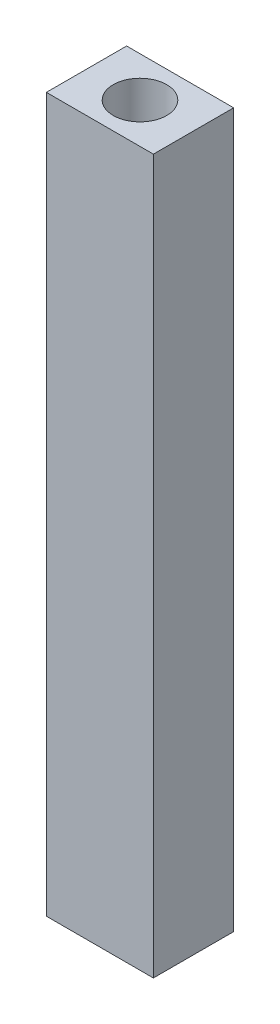
ISO-10303-21;
HEADER;
FILE_DESCRIPTION(('STEP AP214'),'2;1');
FILE_NAME('part.step','',(''),(''),'','','');
FILE_SCHEMA(('AUTOMOTIVE_DESIGN { 1 0 10303 214 1 1 1 1 }'));
ENDSEC;
DATA;
#1=APPLICATION_CONTEXT('core data for automotive mechanical design processes');
#2=APPLICATION_PROTOCOL_DEFINITION('international standard','automotive_design',2000,#1);
#3=PRODUCT_CONTEXT('',#1,'mechanical');
#4=PRODUCT('Part','Part','',(#3));
#5=PRODUCT_RELATED_PRODUCT_CATEGORY('part','',(#4));
#6=PRODUCT_DEFINITION_FORMATION('','',#4);
#7=PRODUCT_DEFINITION_CONTEXT('part definition',#1,'design');
#8=PRODUCT_DEFINITION('design','',#6,#7);
#9=PRODUCT_DEFINITION_SHAPE('','',#8);
#10=(LENGTH_UNIT() NAMED_UNIT(*) SI_UNIT(.MILLI.,.METRE.));
#11=(NAMED_UNIT(*) PLANE_ANGLE_UNIT() SI_UNIT($,.RADIAN.));
#12=(NAMED_UNIT(*) SI_UNIT($,.STERADIAN.) SOLID_ANGLE_UNIT());
#13=UNCERTAINTY_MEASURE_WITH_UNIT(LENGTH_MEASURE(1.E-05),#10,'distance_accuracy_value','');
#14=(GEOMETRIC_REPRESENTATION_CONTEXT(3) GLOBAL_UNCERTAINTY_ASSIGNED_CONTEXT((#13)) GLOBAL_UNIT_ASSIGNED_CONTEXT((#10,
#11,#12)) REPRESENTATION_CONTEXT('',''));
#15=CARTESIAN_POINT('',(0.,0.,0.));
#16=DIRECTION('',(0.,0.,1.));
#17=DIRECTION('',(1.,0.,0.));
#18=AXIS2_PLACEMENT_3D('',#15,#16,#17);
#19=CARTESIAN_POINT('',(6.,80.,4.5));
#20=DIRECTION('',(-1.,0.,0.));
#21=DIRECTION('',(0.,0.,1.));
#22=AXIS2_PLACEMENT_3D('',#19,#20,#21);
#23=PLANE('',#22);
#24=DIRECTION('',(0.,0.,-1.));
#25=VECTOR('',#24,1.);
#26=CARTESIAN_POINT('',(6.,0.,4.5));
#27=LINE('',#26,#25);
#28=CARTESIAN_POINT('',(6.,0.,4.5));
#29=VERTEX_POINT('',#28);
#30=CARTESIAN_POINT('',(6.,0.,-4.5));
#31=VERTEX_POINT('',#30);
#32=EDGE_CURVE('E103',#29,#31,#27,.T.);
#33=ORIENTED_EDGE('',*,*,#32,.T.);
#34=DIRECTION('',(0.,-1.,0.));
#35=VECTOR('',#34,1.);
#36=CARTESIAN_POINT('',(6.,80.,-4.5));
#37=LINE('',#36,#35);
#38=CARTESIAN_POINT('',(6.,80.,-4.5));
#39=VERTEX_POINT('',#38);
#40=EDGE_CURVE('E11',#39,#31,#37,.T.);
#41=ORIENTED_EDGE('',*,*,#40,.F.);
#42=DIRECTION('',(0.,0.,-1.));
#43=VECTOR('',#42,1.);
#44=CARTESIAN_POINT('',(6.,80.,4.5));
#45=LINE('',#44,#43);
#46=CARTESIAN_POINT('',(6.,80.,4.5));
#47=VERTEX_POINT('',#46);
#48=EDGE_CURVE('E91',#47,#39,#45,.T.);
#49=ORIENTED_EDGE('',*,*,#48,.F.);
#50=DIRECTION('',(0.,-1.,0.));
#51=VECTOR('',#50,1.);
#52=CARTESIAN_POINT('',(6.,80.,4.5));
#53=LINE('',#52,#51);
#54=EDGE_CURVE('E99',#47,#29,#53,.T.);
#55=ORIENTED_EDGE('',*,*,#54,.T.);
#56=EDGE_LOOP('',(#33,#41,#49,#55));
#57=FACE_BOUND('',#56,.T.);
#58=ADVANCED_FACE('F40',(#57),#23,.F.);
#59=CARTESIAN_POINT('',(-6.,80.,-4.5));
#60=DIRECTION('',(0.,0.,1.));
#61=DIRECTION('',(1.,0.,0.));
#62=AXIS2_PLACEMENT_3D('',#59,#60,#61);
#63=PLANE('',#62);
#64=DIRECTION('',(-1.,0.,0.));
#65=VECTOR('',#64,1.);
#66=CARTESIAN_POINT('',(-6.,0.,-4.5));
#67=LINE('',#66,#65);
#68=CARTESIAN_POINT('',(-6.,0.,-4.5));
#69=VERTEX_POINT('',#68);
#70=EDGE_CURVE('E95',#31,#69,#67,.T.);
#71=ORIENTED_EDGE('',*,*,#70,.T.);
#72=DIRECTION('',(0.,-1.,0.));
#73=VECTOR('',#72,1.);
#74=CARTESIAN_POINT('',(-6.,80.,-4.5));
#75=LINE('',#74,#73);
#76=CARTESIAN_POINT('',(-6.,80.,-4.5));
#77=VERTEX_POINT('',#76);
#78=EDGE_CURVE('E48',#77,#69,#75,.T.);
#79=ORIENTED_EDGE('',*,*,#78,.F.);
#80=DIRECTION('',(-1.,0.,0.));
#81=VECTOR('',#80,1.);
#82=CARTESIAN_POINT('',(-6.,80.,-4.5));
#83=LINE('',#82,#81);
#84=EDGE_CURVE('E86',#39,#77,#83,.T.);
#85=ORIENTED_EDGE('',*,*,#84,.F.);
#86=ORIENTED_EDGE('',*,*,#40,.T.);
#87=EDGE_LOOP('',(#71,#79,#85,#86));
#88=FACE_BOUND('',#87,.T.);
#89=ADVANCED_FACE('F94',(#88),#63,.F.);
#90=CARTESIAN_POINT('',(-6.,80.,4.5));
#91=DIRECTION('',(1.,0.,0.));
#92=DIRECTION('',(0.,0.,-1.));
#93=AXIS2_PLACEMENT_3D('',#90,#91,#92);
#94=PLANE('',#93);
#95=DIRECTION('',(0.,0.,1.));
#96=VECTOR('',#95,1.);
#97=CARTESIAN_POINT('',(-6.,0.,4.5));
#98=LINE('',#97,#96);
#99=CARTESIAN_POINT('',(-6.,0.,4.5));
#100=VERTEX_POINT('',#99);
#101=EDGE_CURVE('E73',#69,#100,#98,.T.);
#102=ORIENTED_EDGE('',*,*,#101,.T.);
#103=DIRECTION('',(0.,-1.,0.));
#104=VECTOR('',#103,1.);
#105=CARTESIAN_POINT('',(-6.,80.,4.5));
#106=LINE('',#105,#104);
#107=CARTESIAN_POINT('',(-6.,80.,4.5));
#108=VERTEX_POINT('',#107);
#109=EDGE_CURVE('E96',#108,#100,#106,.T.);
#110=ORIENTED_EDGE('',*,*,#109,.F.);
#111=DIRECTION('',(0.,0.,1.));
#112=VECTOR('',#111,1.);
#113=CARTESIAN_POINT('',(-6.,80.,4.5));
#114=LINE('',#113,#112);
#115=EDGE_CURVE('E89',#77,#108,#114,.T.);
#116=ORIENTED_EDGE('',*,*,#115,.F.);
#117=ORIENTED_EDGE('',*,*,#78,.T.);
#118=EDGE_LOOP('',(#102,#110,#116,#117));
#119=FACE_BOUND('',#118,.T.);
#120=ADVANCED_FACE('F97',(#119),#94,.F.);
#121=CARTESIAN_POINT('',(-6.,80.,4.5));
#122=DIRECTION('',(0.,0.,-1.));
#123=DIRECTION('',(-1.,0.,0.));
#124=AXIS2_PLACEMENT_3D('',#121,#122,#123);
#125=PLANE('',#124);
#126=DIRECTION('',(1.,0.,0.));
#127=VECTOR('',#126,1.);
#128=CARTESIAN_POINT('',(-6.,0.,4.5));
#129=LINE('',#128,#127);
#130=EDGE_CURVE('E79',#100,#29,#129,.T.);
#131=ORIENTED_EDGE('',*,*,#130,.T.);
#132=ORIENTED_EDGE('',*,*,#54,.F.);
#133=DIRECTION('',(1.,0.,0.));
#134=VECTOR('',#133,1.);
#135=CARTESIAN_POINT('',(-6.,80.,4.5));
#136=LINE('',#135,#134);
#137=EDGE_CURVE('E56',#108,#47,#136,.T.);
#138=ORIENTED_EDGE('',*,*,#137,.F.);
#139=ORIENTED_EDGE('',*,*,#109,.T.);
#140=EDGE_LOOP('',(#131,#132,#138,#139));
#141=FACE_BOUND('',#140,.T.);
#142=ADVANCED_FACE('F111',(#141),#125,.F.);
#143=CARTESIAN_POINT('',(0.,80.,0.));
#144=DIRECTION('',(0.,-1.,0.));
#145=DIRECTION('',(0.,0.,-1.));
#146=AXIS2_PLACEMENT_3D('',#143,#144,#145);
#147=PLANE('',#146);
#148=CARTESIAN_POINT('',(0.,80.,0.));
#149=DIRECTION('',(0.,1.,0.));
#150=DIRECTION('',(0.,0.,1.));
#151=AXIS2_PLACEMENT_3D('',#148,#149,#150);
#152=CIRCLE('',#151,3.);
#153=CARTESIAN_POINT('',(0.,80.,3.));
#154=VERTEX_POINT('',#153);
#155=EDGE_CURVE('E123',#154,#154,#152,.T.);
#156=ORIENTED_EDGE('',*,*,#155,.F.);
#157=EDGE_LOOP('',(#156));
#158=FACE_BOUND('',#157,.T.);
#159=ORIENTED_EDGE('',*,*,#48,.T.);
#160=ORIENTED_EDGE('',*,*,#84,.T.);
#161=ORIENTED_EDGE('',*,*,#115,.T.);
#162=ORIENTED_EDGE('',*,*,#137,.T.);
#163=EDGE_LOOP('',(#159,#160,#161,#162));
#164=FACE_BOUND('',#163,.T.);
#165=ADVANCED_FACE('F87',(#158,#164),#147,.F.);
#166=CARTESIAN_POINT('',(0.,0.,0.));
#167=DIRECTION('',(0.,-1.,0.));
#168=DIRECTION('',(0.,0.,-1.));
#169=AXIS2_PLACEMENT_3D('',#166,#167,#168);
#170=PLANE('',#169);
#171=CARTESIAN_POINT('',(0.,0.,0.));
#172=DIRECTION('',(0.,-1.,0.));
#173=DIRECTION('',(0.,0.,-1.));
#174=AXIS2_PLACEMENT_3D('',#171,#172,#173);
#175=CIRCLE('',#174,3.);
#176=CARTESIAN_POINT('',(0.,0.,-3.));
#177=VERTEX_POINT('',#176);
#178=EDGE_CURVE('E117',#177,#177,#175,.T.);
#179=ORIENTED_EDGE('',*,*,#178,.F.);
#180=EDGE_LOOP('',(#179));
#181=FACE_BOUND('',#180,.T.);
#182=ORIENTED_EDGE('',*,*,#32,.F.);
#183=ORIENTED_EDGE('',*,*,#130,.F.);
#184=ORIENTED_EDGE('',*,*,#101,.F.);
#185=ORIENTED_EDGE('',*,*,#70,.F.);
#186=EDGE_LOOP('',(#182,#183,#184,#185));
#187=FACE_BOUND('',#186,.T.);
#188=ADVANCED_FACE('F114',(#181,#187),#170,.T.);
#189=CARTESIAN_POINT('',(0.,20.,0.));
#190=DIRECTION('',(0.,-1.,0.));
#191=DIRECTION('',(0.,0.,-1.));
#192=AXIS2_PLACEMENT_3D('',#189,#190,#191);
#193=CYLINDRICAL_SURFACE('',#192,3.);
#194=CARTESIAN_POINT('',(0.,20.,0.));
#195=DIRECTION('',(0.,-1.,0.));
#196=DIRECTION('',(0.,0.,-1.));
#197=AXIS2_PLACEMENT_3D('',#194,#195,#196);
#198=CIRCLE('',#197,3.);
#199=CARTESIAN_POINT('',(0.,20.,-3.));
#200=VERTEX_POINT('',#199);
#201=EDGE_CURVE('E106',#200,#200,#198,.T.);
#202=ORIENTED_EDGE('',*,*,#201,.F.);
#203=EDGE_LOOP('',(#202));
#204=FACE_BOUND('',#203,.T.);
#205=ORIENTED_EDGE('',*,*,#178,.T.);
#206=EDGE_LOOP('',(#205));
#207=FACE_BOUND('',#206,.T.);
#208=ADVANCED_FACE('F144',(#204,#207),#193,.F.);
#209=CARTESIAN_POINT('',(0.,20.,0.));
#210=DIRECTION('',(0.,-1.,0.));
#211=DIRECTION('',(0.,0.,-1.));
#212=AXIS2_PLACEMENT_3D('',#209,#210,#211);
#213=PLANE('',#212);
#214=ORIENTED_EDGE('',*,*,#201,.T.);
#215=EDGE_LOOP('',(#214));
#216=FACE_BOUND('',#215,.T.);
#217=ADVANCED_FACE('F134',(#216),#213,.T.);
#218=CARTESIAN_POINT('',(0.,60.,0.));
#219=DIRECTION('',(0.,1.,0.));
#220=DIRECTION('',(0.,0.,1.));
#221=AXIS2_PLACEMENT_3D('',#218,#219,#220);
#222=CYLINDRICAL_SURFACE('',#221,3.);
#223=CARTESIAN_POINT('',(0.,60.,0.));
#224=DIRECTION('',(0.,1.,0.));
#225=DIRECTION('',(0.,0.,1.));
#226=AXIS2_PLACEMENT_3D('',#223,#224,#225);
#227=CIRCLE('',#226,3.);
#228=CARTESIAN_POINT('',(0.,60.,3.));
#229=VERTEX_POINT('',#228);
#230=EDGE_CURVE('E120',#229,#229,#227,.T.);
#231=ORIENTED_EDGE('',*,*,#230,.F.);
#232=EDGE_LOOP('',(#231));
#233=FACE_BOUND('',#232,.T.);
#234=ORIENTED_EDGE('',*,*,#155,.T.);
#235=EDGE_LOOP('',(#234));
#236=FACE_BOUND('',#235,.T.);
#237=ADVANCED_FACE('F131',(#233,#236),#222,.F.);
#238=CARTESIAN_POINT('',(0.,60.,0.));
#239=DIRECTION('',(0.,1.,0.));
#240=DIRECTION('',(0.,0.,1.));
#241=AXIS2_PLACEMENT_3D('',#238,#239,#240);
#242=PLANE('',#241);
#243=ORIENTED_EDGE('',*,*,#230,.T.);
#244=EDGE_LOOP('',(#243));
#245=FACE_BOUND('',#244,.T.);
#246=ADVANCED_FACE('F129',(#245),#242,.T.);
#247=CLOSED_SHELL('',(#58,#89,#120,#142,#165,#188,#208,#217,#237,#246));
#248=MANIFOLD_SOLID_BREP('B2',#247);
#249=ADVANCED_BREP_SHAPE_REPRESENTATION('',(#18,#248),#14);
#250=SHAPE_DEFINITION_REPRESENTATION(#9,#249);
ENDSEC;
END-ISO-10303-21;
